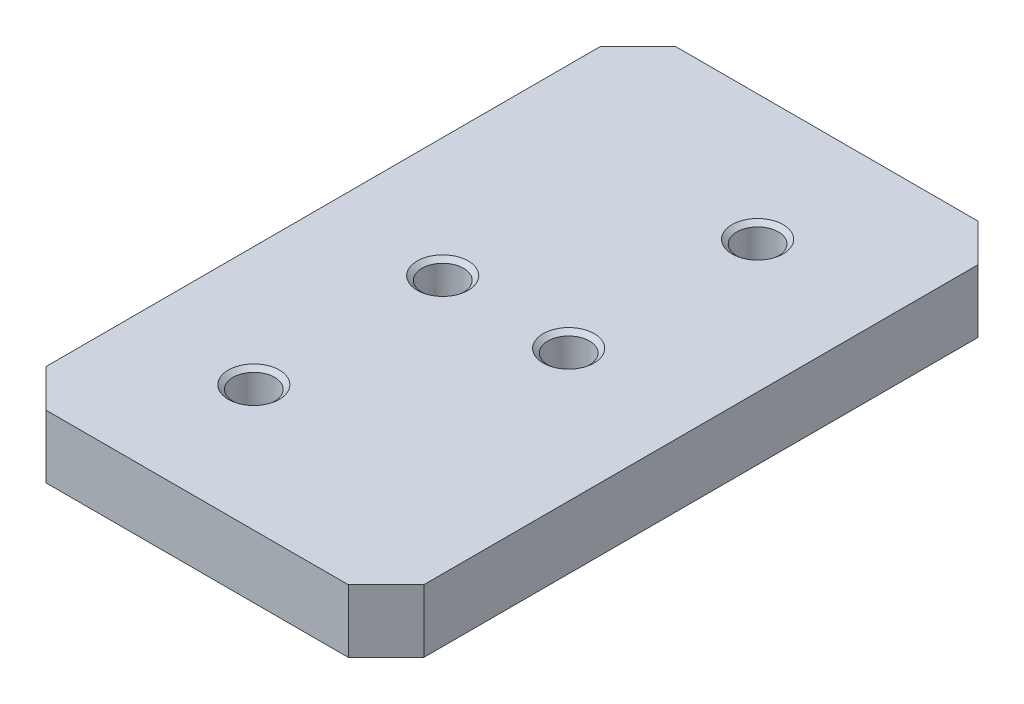
ISO-10303-21;
HEADER;
FILE_DESCRIPTION(('STEP AP214'),'2;1');
FILE_NAME('part.step','',(''),(''),'','','');
FILE_SCHEMA(('AUTOMOTIVE_DESIGN { 1 0 10303 214 1 1 1 1 }'));
ENDSEC;
DATA;
#1=APPLICATION_CONTEXT('core data for automotive mechanical design processes');
#2=APPLICATION_PROTOCOL_DEFINITION('international standard','automotive_design',2000,#1);
#3=PRODUCT_CONTEXT('',#1,'mechanical');
#4=PRODUCT('Part','Part','',(#3));
#5=PRODUCT_RELATED_PRODUCT_CATEGORY('part','',(#4));
#6=PRODUCT_DEFINITION_FORMATION('','',#4);
#7=PRODUCT_DEFINITION_CONTEXT('part definition',#1,'design');
#8=PRODUCT_DEFINITION('design','',#6,#7);
#9=PRODUCT_DEFINITION_SHAPE('','',#8);
#10=(LENGTH_UNIT() NAMED_UNIT(*) SI_UNIT(.MILLI.,.METRE.));
#11=(NAMED_UNIT(*) PLANE_ANGLE_UNIT() SI_UNIT($,.RADIAN.));
#12=(NAMED_UNIT(*) SI_UNIT($,.STERADIAN.) SOLID_ANGLE_UNIT());
#13=UNCERTAINTY_MEASURE_WITH_UNIT(LENGTH_MEASURE(1.E-05),#10,'distance_accuracy_value','');
#14=(GEOMETRIC_REPRESENTATION_CONTEXT(3) GLOBAL_UNCERTAINTY_ASSIGNED_CONTEXT((#13)) GLOBAL_UNIT_ASSIGNED_CONTEXT((#10,
#11,#12)) REPRESENTATION_CONTEXT('',''));
#15=CARTESIAN_POINT('',(0.,0.,0.));
#16=DIRECTION('',(0.,0.,1.));
#17=DIRECTION('',(1.,0.,0.));
#18=AXIS2_PLACEMENT_3D('',#15,#16,#17);
#19=CARTESIAN_POINT('',(15.,5.,25.));
#20=DIRECTION('',(-1.,0.,0.));
#21=DIRECTION('',(0.,0.,1.));
#22=AXIS2_PLACEMENT_3D('',#19,#20,#21);
#23=PLANE('',#22);
#24=DIRECTION('',(0.,0.,-1.));
#25=VECTOR('',#24,1.);
#26=CARTESIAN_POINT('',(15.,5.,25.));
#27=LINE('',#26,#25);
#28=CARTESIAN_POINT('',(15.,5.,22.));
#29=VERTEX_POINT('',#28);
#30=CARTESIAN_POINT('',(15.,5.,-22.));
#31=VERTEX_POINT('',#30);
#32=EDGE_CURVE('E151',#29,#31,#27,.T.);
#33=ORIENTED_EDGE('',*,*,#32,.F.);
#34=DIRECTION('',(0.,-1.,0.));
#35=VECTOR('',#34,1.);
#36=CARTESIAN_POINT('',(15.,5.,22.));
#37=LINE('',#36,#35);
#38=CARTESIAN_POINT('',(15.,0.,22.));
#39=VERTEX_POINT('',#38);
#40=EDGE_CURVE('E11',#29,#39,#37,.T.);
#41=ORIENTED_EDGE('',*,*,#40,.T.);
#42=DIRECTION('',(0.,0.,-1.));
#43=VECTOR('',#42,1.);
#44=CARTESIAN_POINT('',(15.,0.,25.));
#45=LINE('',#44,#43);
#46=CARTESIAN_POINT('',(15.,0.,-22.));
#47=VERTEX_POINT('',#46);
#48=EDGE_CURVE('E153',#39,#47,#45,.T.);
#49=ORIENTED_EDGE('',*,*,#48,.T.);
#50=DIRECTION('',(0.,1.,0.));
#51=VECTOR('',#50,1.);
#52=CARTESIAN_POINT('',(15.,5.,-22.));
#53=LINE('',#52,#51);
#54=EDGE_CURVE('E59',#47,#31,#53,.T.);
#55=ORIENTED_EDGE('',*,*,#54,.T.);
#56=EDGE_LOOP('',(#33,#41,#49,#55));
#57=FACE_BOUND('',#56,.T.);
#58=ADVANCED_FACE('F49',(#57),#23,.F.);
#59=CARTESIAN_POINT('',(-15.,5.,-25.));
#60=DIRECTION('',(0.,0.,1.));
#61=DIRECTION('',(1.,0.,0.));
#62=AXIS2_PLACEMENT_3D('',#59,#60,#61);
#63=PLANE('',#62);
#64=DIRECTION('',(-1.,0.,0.));
#65=VECTOR('',#64,1.);
#66=CARTESIAN_POINT('',(-15.,0.,-25.));
#67=LINE('',#66,#65);
#68=CARTESIAN_POINT('',(12.,0.,-25.));
#69=VERTEX_POINT('',#68);
#70=CARTESIAN_POINT('',(-12.,0.,-25.));
#71=VERTEX_POINT('',#70);
#72=EDGE_CURVE('E147',#69,#71,#67,.T.);
#73=ORIENTED_EDGE('',*,*,#72,.T.);
#74=DIRECTION('',(0.,1.,0.));
#75=VECTOR('',#74,1.);
#76=CARTESIAN_POINT('',(-12.,5.,-25.));
#77=LINE('',#76,#75);
#78=CARTESIAN_POINT('',(-12.,5.,-25.));
#79=VERTEX_POINT('',#78);
#80=EDGE_CURVE('E123',#71,#79,#77,.T.);
#81=ORIENTED_EDGE('',*,*,#80,.T.);
#82=DIRECTION('',(-1.,0.,0.));
#83=VECTOR('',#82,1.);
#84=CARTESIAN_POINT('',(-15.,5.,-25.));
#85=LINE('',#84,#83);
#86=CARTESIAN_POINT('',(12.,5.,-25.));
#87=VERTEX_POINT('',#86);
#88=EDGE_CURVE('E203',#87,#79,#85,.T.);
#89=ORIENTED_EDGE('',*,*,#88,.F.);
#90=DIRECTION('',(0.,-1.,0.));
#91=VECTOR('',#90,1.);
#92=CARTESIAN_POINT('',(12.,5.,-25.));
#93=LINE('',#92,#91);
#94=EDGE_CURVE('E129',#87,#69,#93,.T.);
#95=ORIENTED_EDGE('',*,*,#94,.T.);
#96=EDGE_LOOP('',(#73,#81,#89,#95));
#97=FACE_BOUND('',#96,.T.);
#98=ADVANCED_FACE('F207',(#97),#63,.F.);
#99=CARTESIAN_POINT('',(-15.,5.,25.));
#100=DIRECTION('',(1.,0.,0.));
#101=DIRECTION('',(0.,0.,-1.));
#102=AXIS2_PLACEMENT_3D('',#99,#100,#101);
#103=PLANE('',#102);
#104=DIRECTION('',(0.,0.,1.));
#105=VECTOR('',#104,1.);
#106=CARTESIAN_POINT('',(-15.,5.,25.));
#107=LINE('',#106,#105);
#108=CARTESIAN_POINT('',(-15.,5.,-22.));
#109=VERTEX_POINT('',#108);
#110=CARTESIAN_POINT('',(-15.,5.,22.));
#111=VERTEX_POINT('',#110);
#112=EDGE_CURVE('E138',#109,#111,#107,.T.);
#113=ORIENTED_EDGE('',*,*,#112,.F.);
#114=DIRECTION('',(0.,-1.,0.));
#115=VECTOR('',#114,1.);
#116=CARTESIAN_POINT('',(-15.,5.,-22.));
#117=LINE('',#116,#115);
#118=CARTESIAN_POINT('',(-15.,0.,-22.));
#119=VERTEX_POINT('',#118);
#120=EDGE_CURVE('E122',#109,#119,#117,.T.);
#121=ORIENTED_EDGE('',*,*,#120,.T.);
#122=DIRECTION('',(0.,0.,1.));
#123=VECTOR('',#122,1.);
#124=CARTESIAN_POINT('',(-15.,0.,25.));
#125=LINE('',#124,#123);
#126=CARTESIAN_POINT('',(-15.,0.,22.));
#127=VERTEX_POINT('',#126);
#128=EDGE_CURVE('E136',#119,#127,#125,.T.);
#129=ORIENTED_EDGE('',*,*,#128,.T.);
#130=DIRECTION('',(0.,1.,0.));
#131=VECTOR('',#130,1.);
#132=CARTESIAN_POINT('',(-15.,5.,22.));
#133=LINE('',#132,#131);
#134=EDGE_CURVE('E141',#127,#111,#133,.T.);
#135=ORIENTED_EDGE('',*,*,#134,.T.);
#136=EDGE_LOOP('',(#113,#121,#129,#135));
#137=FACE_BOUND('',#136,.T.);
#138=ADVANCED_FACE('F135',(#137),#103,.F.);
#139=CARTESIAN_POINT('',(-15.,5.,25.));
#140=DIRECTION('',(0.,0.,-1.));
#141=DIRECTION('',(-1.,0.,0.));
#142=AXIS2_PLACEMENT_3D('',#139,#140,#141);
#143=PLANE('',#142);
#144=DIRECTION('',(1.,0.,0.));
#145=VECTOR('',#144,1.);
#146=CARTESIAN_POINT('',(-15.,5.,25.));
#147=LINE('',#146,#145);
#148=CARTESIAN_POINT('',(-12.,5.,25.));
#149=VERTEX_POINT('',#148);
#150=CARTESIAN_POINT('',(12.,5.,25.));
#151=VERTEX_POINT('',#150);
#152=EDGE_CURVE('E158',#149,#151,#147,.T.);
#153=ORIENTED_EDGE('',*,*,#152,.F.);
#154=DIRECTION('',(0.,-1.,0.));
#155=VECTOR('',#154,1.);
#156=CARTESIAN_POINT('',(-12.,5.,25.));
#157=LINE('',#156,#155);
#158=CARTESIAN_POINT('',(-12.,0.,25.));
#159=VERTEX_POINT('',#158);
#160=EDGE_CURVE('E185',#149,#159,#157,.T.);
#161=ORIENTED_EDGE('',*,*,#160,.T.);
#162=DIRECTION('',(1.,0.,0.));
#163=VECTOR('',#162,1.);
#164=CARTESIAN_POINT('',(-15.,0.,25.));
#165=LINE('',#164,#163);
#166=CARTESIAN_POINT('',(12.,0.,25.));
#167=VERTEX_POINT('',#166);
#168=EDGE_CURVE('E146',#159,#167,#165,.T.);
#169=ORIENTED_EDGE('',*,*,#168,.T.);
#170=DIRECTION('',(0.,1.,0.));
#171=VECTOR('',#170,1.);
#172=CARTESIAN_POINT('',(12.,5.,25.));
#173=LINE('',#172,#171);
#174=EDGE_CURVE('E66',#167,#151,#173,.T.);
#175=ORIENTED_EDGE('',*,*,#174,.T.);
#176=EDGE_LOOP('',(#153,#161,#169,#175));
#177=FACE_BOUND('',#176,.T.);
#178=ADVANCED_FACE('F269',(#177),#143,.F.);
#179=CARTESIAN_POINT('',(0.,5.,0.));
#180=DIRECTION('',(0.,-1.,0.));
#181=DIRECTION('',(0.,0.,-1.));
#182=AXIS2_PLACEMENT_3D('',#179,#180,#181);
#183=PLANE('',#182);
#184=CARTESIAN_POINT('',(-5.49999999999999,5.,15.));
#185=DIRECTION('',(0.,1.,0.));
#186=DIRECTION('',(0.,0.,1.));
#187=AXIS2_PLACEMENT_3D('',#184,#185,#186);
#188=CIRCLE('',#187,2.025);
#189=CARTESIAN_POINT('',(-5.49999999999999,5.,17.025));
#190=VERTEX_POINT('',#189);
#191=EDGE_CURVE('E260',#190,#190,#188,.T.);
#192=ORIENTED_EDGE('',*,*,#191,.F.);
#193=EDGE_LOOP('',(#192));
#194=FACE_BOUND('',#193,.T.);
#195=CARTESIAN_POINT('',(-5.49999999999999,5.,0.));
#196=DIRECTION('',(0.,1.,0.));
#197=DIRECTION('',(0.,0.,1.));
#198=AXIS2_PLACEMENT_3D('',#195,#196,#197);
#199=CIRCLE('',#198,2.025);
#200=CARTESIAN_POINT('',(-5.49999999999999,5.,2.025));
#201=VERTEX_POINT('',#200);
#202=EDGE_CURVE('E248',#201,#201,#199,.T.);
#203=ORIENTED_EDGE('',*,*,#202,.F.);
#204=EDGE_LOOP('',(#203));
#205=FACE_BOUND('',#204,.T.);
#206=CARTESIAN_POINT('',(4.5,5.,0.));
#207=DIRECTION('',(0.,1.,0.));
#208=DIRECTION('',(0.,0.,1.));
#209=AXIS2_PLACEMENT_3D('',#206,#207,#208);
#210=CIRCLE('',#209,2.025);
#211=CARTESIAN_POINT('',(4.5,5.,2.025));
#212=VERTEX_POINT('',#211);
#213=EDGE_CURVE('E236',#212,#212,#210,.T.);
#214=ORIENTED_EDGE('',*,*,#213,.F.);
#215=EDGE_LOOP('',(#214));
#216=FACE_BOUND('',#215,.T.);
#217=CARTESIAN_POINT('',(4.5,5.,-15.));
#218=DIRECTION('',(0.,1.,0.));
#219=DIRECTION('',(0.,0.,1.));
#220=AXIS2_PLACEMENT_3D('',#217,#218,#219);
#221=CIRCLE('',#220,2.025);
#222=CARTESIAN_POINT('',(4.5,5.,-12.975));
#223=VERTEX_POINT('',#222);
#224=EDGE_CURVE('E224',#223,#223,#221,.T.);
#225=ORIENTED_EDGE('',*,*,#224,.F.);
#226=EDGE_LOOP('',(#225));
#227=FACE_BOUND('',#226,.T.);
#228=ORIENTED_EDGE('',*,*,#88,.T.);
#229=DIRECTION('',(0.707106781186549,0.,-0.707106781186546));
#230=VECTOR('',#229,1.);
#231=CARTESIAN_POINT('',(-15.,5.,-22.));
#232=LINE('',#231,#230);
#233=EDGE_CURVE('E180',#79,#109,#232,.F.);
#234=ORIENTED_EDGE('',*,*,#233,.T.);
#235=ORIENTED_EDGE('',*,*,#112,.T.);
#236=DIRECTION('',(-0.707106781186547,0.,-0.707106781186548));
#237=VECTOR('',#236,1.);
#238=CARTESIAN_POINT('',(-12.,5.,25.));
#239=LINE('',#238,#237);
#240=EDGE_CURVE('E73',#111,#149,#239,.F.);
#241=ORIENTED_EDGE('',*,*,#240,.T.);
#242=ORIENTED_EDGE('',*,*,#152,.T.);
#243=DIRECTION('',(-0.707106781186549,0.,0.707106781186546));
#244=VECTOR('',#243,1.);
#245=CARTESIAN_POINT('',(15.,5.,22.));
#246=LINE('',#245,#244);
#247=EDGE_CURVE('E175',#151,#29,#246,.F.);
#248=ORIENTED_EDGE('',*,*,#247,.T.);
#249=ORIENTED_EDGE('',*,*,#32,.T.);
#250=DIRECTION('',(0.707106781186547,0.,0.707106781186548));
#251=VECTOR('',#250,1.);
#252=CARTESIAN_POINT('',(12.,5.,-25.));
#253=LINE('',#252,#251);
#254=EDGE_CURVE('E172',#31,#87,#253,.F.);
#255=ORIENTED_EDGE('',*,*,#254,.T.);
#256=EDGE_LOOP('',(#228,#234,#235,#241,#242,#248,#249,#255));
#257=FACE_BOUND('',#256,.T.);
#258=ADVANCED_FACE('F199',(#194,#205,#216,#227,#257),#183,.F.);
#259=CARTESIAN_POINT('',(0.,0.,0.));
#260=DIRECTION('',(0.,-1.,0.));
#261=DIRECTION('',(0.,0.,-1.));
#262=AXIS2_PLACEMENT_3D('',#259,#260,#261);
#263=PLANE('',#262);
#264=CARTESIAN_POINT('',(-5.49999999999999,0.,15.));
#265=DIRECTION('',(0.,1.,0.));
#266=DIRECTION('',(0.,0.,1.));
#267=AXIS2_PLACEMENT_3D('',#264,#265,#266);
#268=CIRCLE('',#267,1.65);
#269=CARTESIAN_POINT('',(-5.49999999999999,0.,16.65));
#270=VERTEX_POINT('',#269);
#271=EDGE_CURVE('E252',#270,#270,#268,.T.);
#272=ORIENTED_EDGE('',*,*,#271,.T.);
#273=EDGE_LOOP('',(#272));
#274=FACE_BOUND('',#273,.T.);
#275=CARTESIAN_POINT('',(-5.49999999999999,0.,0.));
#276=DIRECTION('',(0.,1.,0.));
#277=DIRECTION('',(0.,0.,1.));
#278=AXIS2_PLACEMENT_3D('',#275,#276,#277);
#279=CIRCLE('',#278,1.65);
#280=CARTESIAN_POINT('',(-5.49999999999999,0.,1.65));
#281=VERTEX_POINT('',#280);
#282=EDGE_CURVE('E240',#281,#281,#279,.T.);
#283=ORIENTED_EDGE('',*,*,#282,.T.);
#284=EDGE_LOOP('',(#283));
#285=FACE_BOUND('',#284,.T.);
#286=CARTESIAN_POINT('',(4.5,0.,0.));
#287=DIRECTION('',(0.,1.,0.));
#288=DIRECTION('',(0.,0.,1.));
#289=AXIS2_PLACEMENT_3D('',#286,#287,#288);
#290=CIRCLE('',#289,1.65);
#291=CARTESIAN_POINT('',(4.5,0.,1.64999999999999));
#292=VERTEX_POINT('',#291);
#293=EDGE_CURVE('E228',#292,#292,#290,.T.);
#294=ORIENTED_EDGE('',*,*,#293,.T.);
#295=EDGE_LOOP('',(#294));
#296=FACE_BOUND('',#295,.T.);
#297=CARTESIAN_POINT('',(4.5,0.,-15.));
#298=DIRECTION('',(0.,1.,0.));
#299=DIRECTION('',(0.,0.,1.));
#300=AXIS2_PLACEMENT_3D('',#297,#298,#299);
#301=CIRCLE('',#300,1.65);
#302=CARTESIAN_POINT('',(4.5,0.,-13.35));
#303=VERTEX_POINT('',#302);
#304=EDGE_CURVE('E209',#303,#303,#301,.T.);
#305=ORIENTED_EDGE('',*,*,#304,.T.);
#306=EDGE_LOOP('',(#305));
#307=FACE_BOUND('',#306,.T.);
#308=ORIENTED_EDGE('',*,*,#128,.F.);
#309=DIRECTION('',(-0.707106781186549,0.,0.707106781186546));
#310=VECTOR('',#309,1.);
#311=CARTESIAN_POINT('',(-18.5,0.,-18.5000000000001));
#312=LINE('',#311,#310);
#313=EDGE_CURVE('E118',#119,#71,#312,.F.);
#314=ORIENTED_EDGE('',*,*,#313,.T.);
#315=ORIENTED_EDGE('',*,*,#72,.F.);
#316=DIRECTION('',(-0.707106781186547,0.,-0.707106781186548));
#317=VECTOR('',#316,1.);
#318=CARTESIAN_POINT('',(18.5,0.,-18.5));
#319=LINE('',#318,#317);
#320=EDGE_CURVE('E140',#69,#47,#319,.F.);
#321=ORIENTED_EDGE('',*,*,#320,.T.);
#322=ORIENTED_EDGE('',*,*,#48,.F.);
#323=DIRECTION('',(0.707106781186549,0.,-0.707106781186546));
#324=VECTOR('',#323,1.);
#325=CARTESIAN_POINT('',(18.5,0.,18.5));
#326=LINE('',#325,#324);
#327=EDGE_CURVE('E162',#39,#167,#326,.F.);
#328=ORIENTED_EDGE('',*,*,#327,.T.);
#329=ORIENTED_EDGE('',*,*,#168,.F.);
#330=DIRECTION('',(0.707106781186547,0.,0.707106781186548));
#331=VECTOR('',#330,1.);
#332=CARTESIAN_POINT('',(-18.5,0.,18.5));
#333=LINE('',#332,#331);
#334=EDGE_CURVE('E130',#159,#127,#333,.F.);
#335=ORIENTED_EDGE('',*,*,#334,.T.);
#336=EDGE_LOOP('',(#308,#314,#315,#321,#322,#328,#329,#335));
#337=FACE_BOUND('',#336,.T.);
#338=ADVANCED_FACE('F143',(#274,#285,#296,#307,#337),#263,.T.);
#339=CARTESIAN_POINT('',(4.5,5.,-15.));
#340=DIRECTION('',(0.,1.,0.));
#341=DIRECTION('',(0.,0.,1.));
#342=AXIS2_PLACEMENT_3D('',#339,#340,#341);
#343=CYLINDRICAL_SURFACE('',#342,1.65);
#344=ORIENTED_EDGE('',*,*,#304,.F.);
#345=EDGE_LOOP('',(#344));
#346=FACE_BOUND('',#345,.T.);
#347=CARTESIAN_POINT('',(4.5,4.68533763830852,-15.));
#348=DIRECTION('',(0.,1.,0.));
#349=DIRECTION('',(0.,0.,1.));
#350=AXIS2_PLACEMENT_3D('',#347,#348,#349);
#351=CIRCLE('',#350,1.65);
#352=CARTESIAN_POINT('',(4.5,4.68533763830852,-13.35));
#353=VERTEX_POINT('',#352);
#354=EDGE_CURVE('E212',#353,#353,#351,.T.);
#355=ORIENTED_EDGE('',*,*,#354,.T.);
#356=EDGE_LOOP('',(#355));
#357=FACE_BOUND('',#356,.T.);
#358=ADVANCED_FACE('F280',(#346,#357),#343,.F.);
#359=CARTESIAN_POINT('',(4.5,5.,-15.));
#360=DIRECTION('',(0.,1.,0.));
#361=DIRECTION('',(0.,0.,1.));
#362=AXIS2_PLACEMENT_3D('',#359,#360,#361);
#363=CONICAL_SURFACE('',#362,2.025,0.872664625997162);
#364=ORIENTED_EDGE('',*,*,#354,.F.);
#365=EDGE_LOOP('',(#364));
#366=FACE_BOUND('',#365,.T.);
#367=ORIENTED_EDGE('',*,*,#224,.T.);
#368=EDGE_LOOP('',(#367));
#369=FACE_BOUND('',#368,.T.);
#370=ADVANCED_FACE('F277',(#366,#369),#363,.F.);
#371=CARTESIAN_POINT('',(4.5,5.,0.));
#372=DIRECTION('',(0.,1.,0.));
#373=DIRECTION('',(0.,0.,1.));
#374=AXIS2_PLACEMENT_3D('',#371,#372,#373);
#375=CYLINDRICAL_SURFACE('',#374,1.65);
#376=ORIENTED_EDGE('',*,*,#293,.F.);
#377=EDGE_LOOP('',(#376));
#378=FACE_BOUND('',#377,.T.);
#379=CARTESIAN_POINT('',(4.5,4.68533763830852,0.));
#380=DIRECTION('',(0.,1.,0.));
#381=DIRECTION('',(0.,0.,1.));
#382=AXIS2_PLACEMENT_3D('',#379,#380,#381);
#383=CIRCLE('',#382,1.65);
#384=CARTESIAN_POINT('',(4.5,4.68533763830852,1.65));
#385=VERTEX_POINT('',#384);
#386=EDGE_CURVE('E232',#385,#385,#383,.T.);
#387=ORIENTED_EDGE('',*,*,#386,.T.);
#388=EDGE_LOOP('',(#387));
#389=FACE_BOUND('',#388,.T.);
#390=ADVANCED_FACE('F279',(#378,#389),#375,.F.);
#391=CARTESIAN_POINT('',(4.5,5.,0.));
#392=DIRECTION('',(0.,1.,0.));
#393=DIRECTION('',(0.,0.,1.));
#394=AXIS2_PLACEMENT_3D('',#391,#392,#393);
#395=CONICAL_SURFACE('',#394,2.025,0.872664625997162);
#396=ORIENTED_EDGE('',*,*,#386,.F.);
#397=EDGE_LOOP('',(#396));
#398=FACE_BOUND('',#397,.T.);
#399=ORIENTED_EDGE('',*,*,#213,.T.);
#400=EDGE_LOOP('',(#399));
#401=FACE_BOUND('',#400,.T.);
#402=ADVANCED_FACE('F287',(#398,#401),#395,.F.);
#403=CARTESIAN_POINT('',(-5.49999999999999,5.,0.));
#404=DIRECTION('',(0.,1.,0.));
#405=DIRECTION('',(0.,0.,1.));
#406=AXIS2_PLACEMENT_3D('',#403,#404,#405);
#407=CYLINDRICAL_SURFACE('',#406,1.65);
#408=ORIENTED_EDGE('',*,*,#282,.F.);
#409=EDGE_LOOP('',(#408));
#410=FACE_BOUND('',#409,.T.);
#411=CARTESIAN_POINT('',(-5.49999999999999,4.68533763830852,0.));
#412=DIRECTION('',(0.,1.,0.));
#413=DIRECTION('',(0.,0.,1.));
#414=AXIS2_PLACEMENT_3D('',#411,#412,#413);
#415=CIRCLE('',#414,1.65);
#416=CARTESIAN_POINT('',(-5.49999999999999,4.68533763830852,1.65));
#417=VERTEX_POINT('',#416);
#418=EDGE_CURVE('E244',#417,#417,#415,.T.);
#419=ORIENTED_EDGE('',*,*,#418,.T.);
#420=EDGE_LOOP('',(#419));
#421=FACE_BOUND('',#420,.T.);
#422=ADVANCED_FACE('F427',(#410,#421),#407,.F.);
#423=CARTESIAN_POINT('',(-5.49999999999999,5.,0.));
#424=DIRECTION('',(0.,1.,0.));
#425=DIRECTION('',(0.,0.,1.));
#426=AXIS2_PLACEMENT_3D('',#423,#424,#425);
#427=CONICAL_SURFACE('',#426,2.025,0.872664625997162);
#428=ORIENTED_EDGE('',*,*,#418,.F.);
#429=EDGE_LOOP('',(#428));
#430=FACE_BOUND('',#429,.T.);
#431=ORIENTED_EDGE('',*,*,#202,.T.);
#432=EDGE_LOOP('',(#431));
#433=FACE_BOUND('',#432,.T.);
#434=ADVANCED_FACE('F414',(#430,#433),#427,.F.);
#435=CARTESIAN_POINT('',(-5.49999999999999,5.,15.));
#436=DIRECTION('',(0.,1.,0.));
#437=DIRECTION('',(0.,0.,1.));
#438=AXIS2_PLACEMENT_3D('',#435,#436,#437);
#439=CYLINDRICAL_SURFACE('',#438,1.65);
#440=ORIENTED_EDGE('',*,*,#271,.F.);
#441=EDGE_LOOP('',(#440));
#442=FACE_BOUND('',#441,.T.);
#443=CARTESIAN_POINT('',(-5.49999999999999,4.68533763830852,15.));
#444=DIRECTION('',(0.,1.,0.));
#445=DIRECTION('',(0.,0.,1.));
#446=AXIS2_PLACEMENT_3D('',#443,#444,#445);
#447=CIRCLE('',#446,1.65);
#448=CARTESIAN_POINT('',(-5.49999999999999,4.68533763830852,16.65));
#449=VERTEX_POINT('',#448);
#450=EDGE_CURVE('E256',#449,#449,#447,.T.);
#451=ORIENTED_EDGE('',*,*,#450,.T.);
#452=EDGE_LOOP('',(#451));
#453=FACE_BOUND('',#452,.T.);
#454=ADVANCED_FACE('F400',(#442,#453),#439,.F.);
#455=CARTESIAN_POINT('',(-5.49999999999999,5.,15.));
#456=DIRECTION('',(0.,1.,0.));
#457=DIRECTION('',(0.,0.,1.));
#458=AXIS2_PLACEMENT_3D('',#455,#456,#457);
#459=CONICAL_SURFACE('',#458,2.025,0.872664625997162);
#460=ORIENTED_EDGE('',*,*,#450,.F.);
#461=EDGE_LOOP('',(#460));
#462=FACE_BOUND('',#461,.T.);
#463=ORIENTED_EDGE('',*,*,#191,.T.);
#464=EDGE_LOOP('',(#463));
#465=FACE_BOUND('',#464,.T.);
#466=ADVANCED_FACE('F265',(#462,#465),#459,.F.);
#467=CARTESIAN_POINT('',(-15.,5.,-22.));
#468=DIRECTION('',(0.707106781186546,0.,0.707106781186549));
#469=DIRECTION('',(0.,-1.,0.));
#470=AXIS2_PLACEMENT_3D('',#467,#468,#469);
#471=PLANE('',#470);
#472=ORIENTED_EDGE('',*,*,#233,.F.);
#473=ORIENTED_EDGE('',*,*,#80,.F.);
#474=ORIENTED_EDGE('',*,*,#313,.F.);
#475=ORIENTED_EDGE('',*,*,#120,.F.);
#476=EDGE_LOOP('',(#472,#473,#474,#475));
#477=FACE_BOUND('',#476,.T.);
#478=ADVANCED_FACE('F121',(#477),#471,.F.);
#479=CARTESIAN_POINT('',(-12.,5.,25.));
#480=DIRECTION('',(0.707106781186548,0.,-0.707106781186547));
#481=DIRECTION('',(0.,-1.,0.));
#482=AXIS2_PLACEMENT_3D('',#479,#480,#481);
#483=PLANE('',#482);
#484=ORIENTED_EDGE('',*,*,#240,.F.);
#485=ORIENTED_EDGE('',*,*,#134,.F.);
#486=ORIENTED_EDGE('',*,*,#334,.F.);
#487=ORIENTED_EDGE('',*,*,#160,.F.);
#488=EDGE_LOOP('',(#484,#485,#486,#487));
#489=FACE_BOUND('',#488,.T.);
#490=ADVANCED_FACE('F307',(#489),#483,.F.);
#491=CARTESIAN_POINT('',(15.,5.,22.));
#492=DIRECTION('',(-0.707106781186546,0.,-0.707106781186549));
#493=DIRECTION('',(0.,-1.,0.));
#494=AXIS2_PLACEMENT_3D('',#491,#492,#493);
#495=PLANE('',#494);
#496=ORIENTED_EDGE('',*,*,#247,.F.);
#497=ORIENTED_EDGE('',*,*,#174,.F.);
#498=ORIENTED_EDGE('',*,*,#327,.F.);
#499=ORIENTED_EDGE('',*,*,#40,.F.);
#500=EDGE_LOOP('',(#496,#497,#498,#499));
#501=FACE_BOUND('',#500,.T.);
#502=ADVANCED_FACE('F312',(#501),#495,.F.);
#503=CARTESIAN_POINT('',(12.,5.,-25.));
#504=DIRECTION('',(-0.707106781186548,0.,0.707106781186547));
#505=DIRECTION('',(0.,-1.,0.));
#506=AXIS2_PLACEMENT_3D('',#503,#504,#505);
#507=PLANE('',#506);
#508=ORIENTED_EDGE('',*,*,#254,.F.);
#509=ORIENTED_EDGE('',*,*,#54,.F.);
#510=ORIENTED_EDGE('',*,*,#320,.F.);
#511=ORIENTED_EDGE('',*,*,#94,.F.);
#512=EDGE_LOOP('',(#508,#509,#510,#511));
#513=FACE_BOUND('',#512,.T.);
#514=ADVANCED_FACE('F52',(#513),#507,.F.);
#515=CLOSED_SHELL('',(#58,#98,#138,#178,#258,#338,#358,#370,#390,#402,#422,#434,#454,#466,#478,
#490,#502,#514));
#516=MANIFOLD_SOLID_BREP('B2',#515);
#517=ADVANCED_BREP_SHAPE_REPRESENTATION('',(#18,#516),#14);
#518=SHAPE_DEFINITION_REPRESENTATION(#9,#517);
ENDSEC;
END-ISO-10303-21;
